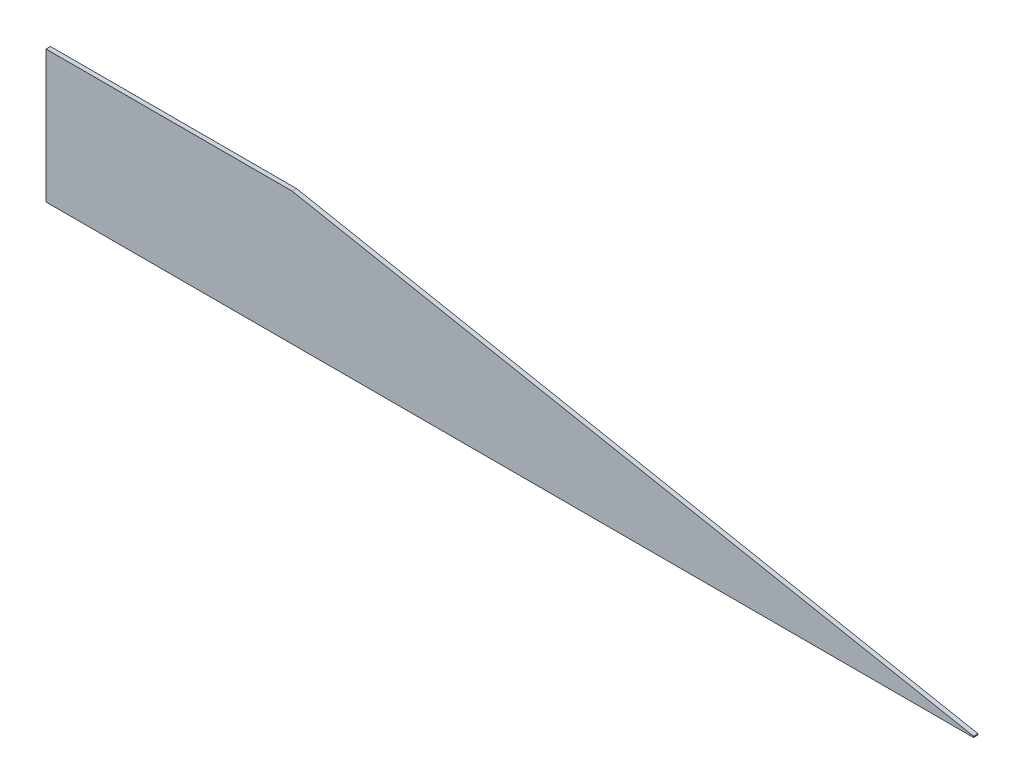
ISO-10303-21;
HEADER;
FILE_DESCRIPTION(('STEP AP214'),'2;1');
FILE_NAME('part.step','',(''),(''),'','','');
FILE_SCHEMA(('AUTOMOTIVE_DESIGN { 1 0 10303 214 1 1 1 1 }'));
ENDSEC;
DATA;
#1=APPLICATION_CONTEXT('core data for automotive mechanical design processes');
#2=APPLICATION_PROTOCOL_DEFINITION('international standard','automotive_design',2000,#1);
#3=PRODUCT_CONTEXT('',#1,'mechanical');
#4=PRODUCT('Part','Part','',(#3));
#5=PRODUCT_RELATED_PRODUCT_CATEGORY('part','',(#4));
#6=PRODUCT_DEFINITION_FORMATION('','',#4);
#7=PRODUCT_DEFINITION_CONTEXT('part definition',#1,'design');
#8=PRODUCT_DEFINITION('design','',#6,#7);
#9=PRODUCT_DEFINITION_SHAPE('','',#8);
#10=(LENGTH_UNIT() NAMED_UNIT(*) SI_UNIT(.MILLI.,.METRE.));
#11=(NAMED_UNIT(*) PLANE_ANGLE_UNIT() SI_UNIT($,.RADIAN.));
#12=(NAMED_UNIT(*) SI_UNIT($,.STERADIAN.) SOLID_ANGLE_UNIT());
#13=UNCERTAINTY_MEASURE_WITH_UNIT(LENGTH_MEASURE(1.E-05),#10,'distance_accuracy_value','');
#14=(GEOMETRIC_REPRESENTATION_CONTEXT(3) GLOBAL_UNCERTAINTY_ASSIGNED_CONTEXT((#13)) GLOBAL_UNIT_ASSIGNED_CONTEXT((#10,
#11,#12)) REPRESENTATION_CONTEXT('',''));
#15=CARTESIAN_POINT('',(0.,0.,0.));
#16=DIRECTION('',(0.,0.,1.));
#17=DIRECTION('',(1.,0.,0.));
#18=AXIS2_PLACEMENT_3D('',#15,#16,#17);
#19=CARTESIAN_POINT('',(778.,69.99,-0.01));
#20=DIRECTION('',(1.,0.,0.));
#21=DIRECTION('',(0.,1.,0.));
#22=AXIS2_PLACEMENT_3D('',#19,#20,#21);
#23=PLANE('',#22);
#24=DIRECTION('',(0.,-1.,0.));
#25=VECTOR('',#24,1.);
#26=CARTESIAN_POINT('',(778.,70.6445854996187,5.));
#27=LINE('',#26,#25);
#28=CARTESIAN_POINT('',(778.,71.2891709992374,5.));
#29=VERTEX_POINT('',#28);
#30=CARTESIAN_POINT('',(778.,70.,5.));
#31=VERTEX_POINT('',#30);
#32=EDGE_CURVE('E89',#29,#31,#27,.T.);
#33=ORIENTED_EDGE('',*,*,#32,.T.);
#34=DIRECTION('',(0.,0.,1.));
#35=VECTOR('',#34,1.);
#36=CARTESIAN_POINT('',(778.,70.,2.5));
#37=LINE('',#36,#35);
#38=CARTESIAN_POINT('',(778.,70.,0.));
#39=VERTEX_POINT('',#38);
#40=EDGE_CURVE('E94',#39,#31,#37,.T.);
#41=ORIENTED_EDGE('',*,*,#40,.F.);
#42=DIRECTION('',(0.,-1.,0.));
#43=VECTOR('',#42,1.);
#44=CARTESIAN_POINT('',(778.,145.,0.));
#45=LINE('',#44,#43);
#46=CARTESIAN_POINT('',(778.,71.2891709992374,0.));
#47=VERTEX_POINT('',#46);
#48=EDGE_CURVE('E72',#47,#39,#45,.T.);
#49=ORIENTED_EDGE('',*,*,#48,.F.);
#50=DIRECTION('',(0.,0.,-1.));
#51=VECTOR('',#50,1.);
#52=CARTESIAN_POINT('',(778.,71.2891709992374,2.5));
#53=LINE('',#52,#51);
#54=EDGE_CURVE('E69',#29,#47,#53,.T.);
#55=ORIENTED_EDGE('',*,*,#54,.F.);
#56=EDGE_LOOP('',(#33,#41,#49,#55));
#57=FACE_BOUND('',#56,.T.);
#58=ADVANCED_FACE('F17',(#57),#23,.T.);
#59=CARTESIAN_POINT('',(778.009819163138,71.2872778443907,-0.01));
#60=DIRECTION('',(0.189315484661945,0.981916313779954,0.));
#61=DIRECTION('',(-0.981916313779954,0.189315484661945,0.));
#62=AXIS2_PLACEMENT_3D('',#59,#60,#61);
#63=PLANE('',#62);
#64=DIRECTION('',(-0.981916313779954,0.189315484661945,0.));
#65=VECTOR('',#64,1.);
#66=CARTESIAN_POINT('',(778.,71.2891709992374,5.));
#67=LINE('',#66,#65);
#68=CARTESIAN_POINT('',(6.68650024937822,220.,5.));
#69=VERTEX_POINT('',#68);
#70=EDGE_CURVE('E79',#29,#69,#67,.T.);
#71=ORIENTED_EDGE('',*,*,#70,.F.);
#72=ORIENTED_EDGE('',*,*,#54,.T.);
#73=DIRECTION('',(0.981916313779954,-0.189315484661945,0.));
#74=VECTOR('',#73,1.);
#75=CARTESIAN_POINT('',(6.68650024937822,220.,0.));
#76=LINE('',#75,#74);
#77=CARTESIAN_POINT('',(6.68650024937828,220.,0.));
#78=VERTEX_POINT('',#77);
#79=EDGE_CURVE('E21',#78,#47,#76,.T.);
#80=ORIENTED_EDGE('',*,*,#79,.F.);
#81=DIRECTION('',(0.,0.,-1.));
#82=VECTOR('',#81,1.);
#83=CARTESIAN_POINT('',(6.68650024937833,220.,2.5));
#84=LINE('',#83,#82);
#85=EDGE_CURVE('E67',#69,#78,#84,.T.);
#86=ORIENTED_EDGE('',*,*,#85,.F.);
#87=EDGE_LOOP('',(#71,#72,#80,#86));
#88=FACE_BOUND('',#87,.T.);
#89=ADVANCED_FACE('F65',(#88),#63,.T.);
#90=CARTESIAN_POINT('',(778.01,69.99,0.));
#91=DIRECTION('',(0.,0.,-1.));
#92=DIRECTION('',(-1.,0.,0.));
#93=AXIS2_PLACEMENT_3D('',#90,#91,#92);
#94=PLANE('',#93);
#95=DIRECTION('',(1.,0.,0.));
#96=VECTOR('',#95,1.);
#97=CARTESIAN_POINT('',(253.,70.,0.));
#98=LINE('',#97,#96);
#99=CARTESIAN_POINT('',(-272.,70.,0.));
#100=VERTEX_POINT('',#99);
#101=EDGE_CURVE('E91',#100,#39,#98,.T.);
#102=ORIENTED_EDGE('',*,*,#101,.F.);
#103=DIRECTION('',(0.,-1.,0.));
#104=VECTOR('',#103,1.);
#105=CARTESIAN_POINT('',(-272.,145.,0.));
#106=LINE('',#105,#104);
#107=CARTESIAN_POINT('',(-272.,220.,0.));
#108=VERTEX_POINT('',#107);
#109=EDGE_CURVE('E77',#108,#100,#106,.T.);
#110=ORIENTED_EDGE('',*,*,#109,.F.);
#111=DIRECTION('',(-1.,0.,0.));
#112=VECTOR('',#111,1.);
#113=CARTESIAN_POINT('',(-132.656749875311,220.,0.));
#114=LINE('',#113,#112);
#115=EDGE_CURVE('E74',#78,#108,#114,.T.);
#116=ORIENTED_EDGE('',*,*,#115,.F.);
#117=ORIENTED_EDGE('',*,*,#79,.T.);
#118=ORIENTED_EDGE('',*,*,#48,.T.);
#119=EDGE_LOOP('',(#102,#110,#116,#117,#118));
#120=FACE_BOUND('',#119,.T.);
#121=ADVANCED_FACE('F75',(#120),#94,.T.);
#122=CARTESIAN_POINT('',(-272.01,70.,-0.01));
#123=DIRECTION('',(0.,-1.,0.));
#124=DIRECTION('',(1.,0.,0.));
#125=AXIS2_PLACEMENT_3D('',#122,#123,#124);
#126=PLANE('',#125);
#127=DIRECTION('',(1.,0.,0.));
#128=VECTOR('',#127,1.);
#129=CARTESIAN_POINT('',(253.,70.,5.));
#130=LINE('',#129,#128);
#131=CARTESIAN_POINT('',(-272.,70.,5.));
#132=VERTEX_POINT('',#131);
#133=EDGE_CURVE('E92',#132,#31,#130,.T.);
#134=ORIENTED_EDGE('',*,*,#133,.F.);
#135=DIRECTION('',(0.,0.,1.));
#136=VECTOR('',#135,1.);
#137=CARTESIAN_POINT('',(-272.,70.,2.5));
#138=LINE('',#137,#136);
#139=EDGE_CURVE('E83',#100,#132,#138,.T.);
#140=ORIENTED_EDGE('',*,*,#139,.F.);
#141=ORIENTED_EDGE('',*,*,#101,.T.);
#142=ORIENTED_EDGE('',*,*,#40,.T.);
#143=EDGE_LOOP('',(#134,#140,#141,#142));
#144=FACE_BOUND('',#143,.T.);
#145=ADVANCED_FACE('F102',(#144),#126,.T.);
#146=CARTESIAN_POINT('',(-272.01,69.99,5.));
#147=DIRECTION('',(0.,0.,1.));
#148=DIRECTION('',(1.,0.,0.));
#149=AXIS2_PLACEMENT_3D('',#146,#147,#148);
#150=PLANE('',#149);
#151=ORIENTED_EDGE('',*,*,#32,.F.);
#152=ORIENTED_EDGE('',*,*,#70,.T.);
#153=DIRECTION('',(1.,0.,0.));
#154=VECTOR('',#153,1.);
#155=CARTESIAN_POINT('',(-132.656749875311,220.,5.));
#156=LINE('',#155,#154);
#157=CARTESIAN_POINT('',(-272.,220.,5.));
#158=VERTEX_POINT('',#157);
#159=EDGE_CURVE('E36',#158,#69,#156,.T.);
#160=ORIENTED_EDGE('',*,*,#159,.F.);
#161=DIRECTION('',(0.,1.,0.));
#162=VECTOR('',#161,1.);
#163=CARTESIAN_POINT('',(-272.,145.,5.));
#164=LINE('',#163,#162);
#165=EDGE_CURVE('E27',#132,#158,#164,.T.);
#166=ORIENTED_EDGE('',*,*,#165,.F.);
#167=ORIENTED_EDGE('',*,*,#133,.T.);
#168=EDGE_LOOP('',(#151,#152,#160,#166,#167));
#169=FACE_BOUND('',#168,.T.);
#170=ADVANCED_FACE('F106',(#169),#150,.T.);
#171=CARTESIAN_POINT('',(6.69650024937834,220.,-0.01));
#172=DIRECTION('',(0.,1.,0.));
#173=DIRECTION('',(-1.,0.,0.));
#174=AXIS2_PLACEMENT_3D('',#171,#172,#173);
#175=PLANE('',#174);
#176=ORIENTED_EDGE('',*,*,#159,.T.);
#177=ORIENTED_EDGE('',*,*,#85,.T.);
#178=ORIENTED_EDGE('',*,*,#115,.T.);
#179=DIRECTION('',(0.,0.,-1.));
#180=VECTOR('',#179,1.);
#181=CARTESIAN_POINT('',(-272.,220.,2.5));
#182=LINE('',#181,#180);
#183=EDGE_CURVE('E11',#158,#108,#182,.T.);
#184=ORIENTED_EDGE('',*,*,#183,.F.);
#185=EDGE_LOOP('',(#176,#177,#178,#184));
#186=FACE_BOUND('',#185,.T.);
#187=ADVANCED_FACE('F81',(#186),#175,.T.);
#188=CARTESIAN_POINT('',(-272.,220.01,-0.01));
#189=DIRECTION('',(-1.,0.,0.));
#190=DIRECTION('',(0.,-1.,0.));
#191=AXIS2_PLACEMENT_3D('',#188,#189,#190);
#192=PLANE('',#191);
#193=ORIENTED_EDGE('',*,*,#165,.T.);
#194=ORIENTED_EDGE('',*,*,#183,.T.);
#195=ORIENTED_EDGE('',*,*,#109,.T.);
#196=ORIENTED_EDGE('',*,*,#139,.T.);
#197=EDGE_LOOP('',(#193,#194,#195,#196));
#198=FACE_BOUND('',#197,.T.);
#199=ADVANCED_FACE('F19',(#198),#192,.T.);
#200=CLOSED_SHELL('',(#58,#89,#121,#145,#170,#187,#199));
#201=MANIFOLD_SOLID_BREP('B1',#200);
#202=ADVANCED_BREP_SHAPE_REPRESENTATION('',(#18,#201),#14);
#203=SHAPE_DEFINITION_REPRESENTATION(#9,#202);
ENDSEC;
END-ISO-10303-21;
